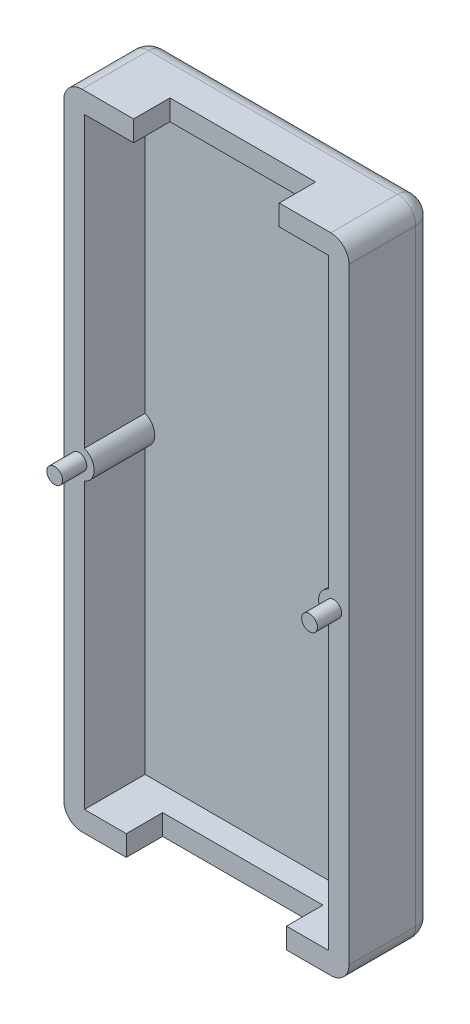
ISO-10303-21;
HEADER;
FILE_DESCRIPTION(('STEP AP214'),'2;1');
FILE_NAME('part.step','',(''),(''),'','','');
FILE_SCHEMA(('AUTOMOTIVE_DESIGN { 1 0 10303 214 1 1 1 1 }'));
ENDSEC;
DATA;
#1=APPLICATION_CONTEXT('core data for automotive mechanical design processes');
#2=APPLICATION_PROTOCOL_DEFINITION('international standard','automotive_design',2000,#1);
#3=PRODUCT_CONTEXT('',#1,'mechanical');
#4=PRODUCT('Part','Part','',(#3));
#5=PRODUCT_RELATED_PRODUCT_CATEGORY('part','',(#4));
#6=PRODUCT_DEFINITION_FORMATION('','',#4);
#7=PRODUCT_DEFINITION_CONTEXT('part definition',#1,'design');
#8=PRODUCT_DEFINITION('design','',#6,#7);
#9=PRODUCT_DEFINITION_SHAPE('','',#8);
#10=(LENGTH_UNIT() NAMED_UNIT(*) SI_UNIT(.MILLI.,.METRE.));
#11=(NAMED_UNIT(*) PLANE_ANGLE_UNIT() SI_UNIT($,.RADIAN.));
#12=(NAMED_UNIT(*) SI_UNIT($,.STERADIAN.) SOLID_ANGLE_UNIT());
#13=UNCERTAINTY_MEASURE_WITH_UNIT(LENGTH_MEASURE(1.E-05),#10,'distance_accuracy_value','');
#14=(GEOMETRIC_REPRESENTATION_CONTEXT(3) GLOBAL_UNCERTAINTY_ASSIGNED_CONTEXT((#13)) GLOBAL_UNIT_ASSIGNED_CONTEXT((#10,
#11,#12)) REPRESENTATION_CONTEXT('',''));
#15=CARTESIAN_POINT('',(0.,0.,0.));
#16=DIRECTION('',(0.,0.,1.));
#17=DIRECTION('',(1.,0.,0.));
#18=AXIS2_PLACEMENT_3D('',#15,#16,#17);
#19=CARTESIAN_POINT('',(0.,-51.3,7.));
#20=DIRECTION('',(0.,1.,0.));
#21=DIRECTION('',(0.,0.,1.));
#22=AXIS2_PLACEMENT_3D('',#19,#20,#21);
#23=PLANE('',#22);
#24=DIRECTION('',(-1.,0.,0.));
#25=VECTOR('',#24,1.);
#26=CARTESIAN_POINT('',(0.,-51.3,4.));
#27=LINE('',#26,#25);
#28=CARTESIAN_POINT('',(18.35,-51.3,4.));
#29=VERTEX_POINT('',#28);
#30=CARTESIAN_POINT('',(5.15,-51.3,4.));
#31=VERTEX_POINT('',#30);
#32=EDGE_CURVE('E233',#29,#31,#27,.T.);
#33=ORIENTED_EDGE('',*,*,#32,.F.);
#34=DIRECTION('',(0.,0.,1.));
#35=VECTOR('',#34,1.);
#36=CARTESIAN_POINT('',(18.35,-51.3,4.));
#37=LINE('',#36,#35);
#38=CARTESIAN_POINT('',(18.35,-51.3,7.));
#39=VERTEX_POINT('',#38);
#40=EDGE_CURVE('E216',#29,#39,#37,.T.);
#41=ORIENTED_EDGE('',*,*,#40,.T.);
#42=DIRECTION('',(1.,0.,0.));
#43=VECTOR('',#42,1.);
#44=CARTESIAN_POINT('',(0.,-51.3,7.));
#45=LINE('',#44,#43);
#46=CARTESIAN_POINT('',(21.8,-51.3,7.));
#47=VERTEX_POINT('',#46);
#48=EDGE_CURVE('E332',#39,#47,#45,.T.);
#49=ORIENTED_EDGE('',*,*,#48,.T.);
#50=DIRECTION('',(0.,0.,-1.));
#51=VECTOR('',#50,1.);
#52=CARTESIAN_POINT('',(21.8,-51.3,7.));
#53=LINE('',#52,#51);
#54=CARTESIAN_POINT('',(21.8,-51.3,2.));
#55=VERTEX_POINT('',#54);
#56=EDGE_CURVE('E352',#47,#55,#53,.T.);
#57=ORIENTED_EDGE('',*,*,#56,.T.);
#58=DIRECTION('',(1.,0.,0.));
#59=VECTOR('',#58,1.);
#60=CARTESIAN_POINT('',(0.,-51.3,2.));
#61=LINE('',#60,#59);
#62=CARTESIAN_POINT('',(1.70000000000001,-51.3,2.));
#63=VERTEX_POINT('',#62);
#64=EDGE_CURVE('E299',#63,#55,#61,.T.);
#65=ORIENTED_EDGE('',*,*,#64,.F.);
#66=DIRECTION('',(0.,0.,-1.));
#67=VECTOR('',#66,1.);
#68=CARTESIAN_POINT('',(1.70000000000001,-51.3,7.));
#69=LINE('',#68,#67);
#70=CARTESIAN_POINT('',(1.70000000000001,-51.3,7.));
#71=VERTEX_POINT('',#70);
#72=EDGE_CURVE('E349',#71,#63,#69,.T.);
#73=ORIENTED_EDGE('',*,*,#72,.F.);
#74=CARTESIAN_POINT('',(5.15,-51.3,7.));
#75=VERTEX_POINT('',#74);
#76=EDGE_CURVE('E333',#71,#75,#45,.T.);
#77=ORIENTED_EDGE('',*,*,#76,.T.);
#78=DIRECTION('',(0.,0.,1.));
#79=VECTOR('',#78,1.);
#80=CARTESIAN_POINT('',(5.15,-51.3,4.));
#81=LINE('',#80,#79);
#82=EDGE_CURVE('E226',#31,#75,#81,.T.);
#83=ORIENTED_EDGE('',*,*,#82,.F.);
#84=EDGE_LOOP('',(#33,#41,#49,#57,#65,#73,#77,#83));
#85=FACE_BOUND('',#84,.T.);
#86=ADVANCED_FACE('F43',(#85),#23,.T.);
#87=CARTESIAN_POINT('',(0.,-53.,7.));
#88=DIRECTION('',(0.,1.,0.));
#89=DIRECTION('',(0.,0.,1.));
#90=AXIS2_PLACEMENT_3D('',#87,#88,#89);
#91=PLANE('',#90);
#92=DIRECTION('',(1.,0.,0.));
#93=VECTOR('',#92,1.);
#94=CARTESIAN_POINT('',(0.,-53.,1.5));
#95=LINE('',#94,#93);
#96=CARTESIAN_POINT('',(1.50000000000001,-53.,1.5));
#97=VERTEX_POINT('',#96);
#98=CARTESIAN_POINT('',(22.,-53.,1.5));
#99=VERTEX_POINT('',#98);
#100=EDGE_CURVE('E379',#97,#99,#95,.T.);
#101=ORIENTED_EDGE('',*,*,#100,.T.);
#102=DIRECTION('',(0.,0.,-1.));
#103=VECTOR('',#102,1.);
#104=CARTESIAN_POINT('',(22.,-53.,7.));
#105=LINE('',#104,#103);
#106=CARTESIAN_POINT('',(22.,-53.,7.));
#107=VERTEX_POINT('',#106);
#108=EDGE_CURVE('E381',#99,#107,#105,.F.);
#109=ORIENTED_EDGE('',*,*,#108,.T.);
#110=DIRECTION('',(1.,0.,0.));
#111=VECTOR('',#110,1.);
#112=CARTESIAN_POINT('',(0.,-53.,7.));
#113=LINE('',#112,#111);
#114=CARTESIAN_POINT('',(18.35,-53.,7.));
#115=VERTEX_POINT('',#114);
#116=EDGE_CURVE('E317',#115,#107,#113,.T.);
#117=ORIENTED_EDGE('',*,*,#116,.F.);
#118=DIRECTION('',(0.,0.,1.));
#119=VECTOR('',#118,1.);
#120=CARTESIAN_POINT('',(18.35,-53.,4.));
#121=LINE('',#120,#119);
#122=CARTESIAN_POINT('',(18.35,-53.,4.));
#123=VERTEX_POINT('',#122);
#124=EDGE_CURVE('E250',#123,#115,#121,.T.);
#125=ORIENTED_EDGE('',*,*,#124,.F.);
#126=DIRECTION('',(1.,0.,0.));
#127=VECTOR('',#126,1.);
#128=CARTESIAN_POINT('',(0.,-53.,4.));
#129=LINE('',#128,#127);
#130=CARTESIAN_POINT('',(5.15,-53.,4.));
#131=VERTEX_POINT('',#130);
#132=EDGE_CURVE('E227',#131,#123,#129,.T.);
#133=ORIENTED_EDGE('',*,*,#132,.F.);
#134=DIRECTION('',(0.,0.,1.));
#135=VECTOR('',#134,1.);
#136=CARTESIAN_POINT('',(5.15,-53.,4.));
#137=LINE('',#136,#135);
#138=CARTESIAN_POINT('',(5.15,-53.,7.));
#139=VERTEX_POINT('',#138);
#140=EDGE_CURVE('E253',#131,#139,#137,.T.);
#141=ORIENTED_EDGE('',*,*,#140,.T.);
#142=CARTESIAN_POINT('',(1.50000000000001,-53.,7.));
#143=VERTEX_POINT('',#142);
#144=EDGE_CURVE('E318',#143,#139,#113,.T.);
#145=ORIENTED_EDGE('',*,*,#144,.F.);
#146=DIRECTION('',(0.,0.,-1.));
#147=VECTOR('',#146,1.);
#148=CARTESIAN_POINT('',(1.50000000000001,-53.,7.));
#149=LINE('',#148,#147);
#150=EDGE_CURVE('E377',#143,#97,#149,.T.);
#151=ORIENTED_EDGE('',*,*,#150,.T.);
#152=EDGE_LOOP('',(#101,#109,#117,#125,#133,#141,#145,#151));
#153=FACE_BOUND('',#152,.T.);
#154=ADVANCED_FACE('F501',(#153),#91,.F.);
#155=CARTESIAN_POINT('',(0.,0.,7.));
#156=DIRECTION('',(0.,1.,0.));
#157=DIRECTION('',(0.,0.,1.));
#158=AXIS2_PLACEMENT_3D('',#155,#156,#157);
#159=PLANE('',#158);
#160=DIRECTION('',(1.,0.,0.));
#161=VECTOR('',#160,1.);
#162=CARTESIAN_POINT('',(0.,0.,1.5));
#163=LINE('',#162,#161);
#164=CARTESIAN_POINT('',(22.,0.,1.5));
#165=VERTEX_POINT('',#164);
#166=CARTESIAN_POINT('',(1.5,0.,1.5));
#167=VERTEX_POINT('',#166);
#168=EDGE_CURVE('E366',#165,#167,#163,.F.);
#169=ORIENTED_EDGE('',*,*,#168,.T.);
#170=DIRECTION('',(0.,0.,-1.));
#171=VECTOR('',#170,1.);
#172=CARTESIAN_POINT('',(1.5,0.,7.));
#173=LINE('',#172,#171);
#174=CARTESIAN_POINT('',(1.5,0.,7.));
#175=VERTEX_POINT('',#174);
#176=EDGE_CURVE('E369',#167,#175,#173,.F.);
#177=ORIENTED_EDGE('',*,*,#176,.T.);
#178=DIRECTION('',(1.,0.,0.));
#179=VECTOR('',#178,1.);
#180=CARTESIAN_POINT('',(0.,0.,7.));
#181=LINE('',#180,#179);
#182=CARTESIAN_POINT('',(5.75,0.,7.));
#183=VERTEX_POINT('',#182);
#184=EDGE_CURVE('E323',#175,#183,#181,.T.);
#185=ORIENTED_EDGE('',*,*,#184,.T.);
#186=DIRECTION('',(0.,0.,1.));
#187=VECTOR('',#186,1.);
#188=CARTESIAN_POINT('',(5.75,0.,4.));
#189=LINE('',#188,#187);
#190=CARTESIAN_POINT('',(5.75,0.,4.));
#191=VERTEX_POINT('',#190);
#192=EDGE_CURVE('E279',#191,#183,#189,.T.);
#193=ORIENTED_EDGE('',*,*,#192,.F.);
#194=DIRECTION('',(-1.,0.,0.));
#195=VECTOR('',#194,1.);
#196=CARTESIAN_POINT('',(0.,0.,4.));
#197=LINE('',#196,#195);
#198=CARTESIAN_POINT('',(17.75,0.,4.));
#199=VERTEX_POINT('',#198);
#200=EDGE_CURVE('E259',#199,#191,#197,.T.);
#201=ORIENTED_EDGE('',*,*,#200,.F.);
#202=DIRECTION('',(0.,0.,1.));
#203=VECTOR('',#202,1.);
#204=CARTESIAN_POINT('',(17.75,0.,4.));
#205=LINE('',#204,#203);
#206=CARTESIAN_POINT('',(17.75,0.,7.));
#207=VERTEX_POINT('',#206);
#208=EDGE_CURVE('E269',#199,#207,#205,.T.);
#209=ORIENTED_EDGE('',*,*,#208,.T.);
#210=CARTESIAN_POINT('',(22.,0.,7.));
#211=VERTEX_POINT('',#210);
#212=EDGE_CURVE('E322',#207,#211,#181,.T.);
#213=ORIENTED_EDGE('',*,*,#212,.T.);
#214=DIRECTION('',(0.,0.,-1.));
#215=VECTOR('',#214,1.);
#216=CARTESIAN_POINT('',(22.,0.,7.));
#217=LINE('',#216,#215);
#218=EDGE_CURVE('E364',#211,#165,#217,.T.);
#219=ORIENTED_EDGE('',*,*,#218,.T.);
#220=EDGE_LOOP('',(#169,#177,#185,#193,#201,#209,#213,#219));
#221=FACE_BOUND('',#220,.T.);
#222=ADVANCED_FACE('F461',(#221),#159,.T.);
#223=CARTESIAN_POINT('',(0.,-1.7,7.));
#224=DIRECTION('',(0.,1.,0.));
#225=DIRECTION('',(0.,0.,1.));
#226=AXIS2_PLACEMENT_3D('',#223,#224,#225);
#227=PLANE('',#226);
#228=DIRECTION('',(0.,0.,1.));
#229=VECTOR('',#228,1.);
#230=CARTESIAN_POINT('',(17.75,-1.7,4.));
#231=LINE('',#230,#229);
#232=CARTESIAN_POINT('',(17.75,-1.7,4.));
#233=VERTEX_POINT('',#232);
#234=CARTESIAN_POINT('',(17.75,-1.7,7.));
#235=VERTEX_POINT('',#234);
#236=EDGE_CURVE('E247',#233,#235,#231,.T.);
#237=ORIENTED_EDGE('',*,*,#236,.F.);
#238=DIRECTION('',(1.,0.,0.));
#239=VECTOR('',#238,1.);
#240=CARTESIAN_POINT('',(0.,-1.7,4.));
#241=LINE('',#240,#239);
#242=CARTESIAN_POINT('',(5.75,-1.7,4.));
#243=VERTEX_POINT('',#242);
#244=EDGE_CURVE('E266',#243,#233,#241,.T.);
#245=ORIENTED_EDGE('',*,*,#244,.F.);
#246=DIRECTION('',(0.,0.,1.));
#247=VECTOR('',#246,1.);
#248=CARTESIAN_POINT('',(5.75,-1.7,4.));
#249=LINE('',#248,#247);
#250=CARTESIAN_POINT('',(5.75,-1.7,7.));
#251=VERTEX_POINT('',#250);
#252=EDGE_CURVE('E276',#243,#251,#249,.T.);
#253=ORIENTED_EDGE('',*,*,#252,.T.);
#254=DIRECTION('',(1.,0.,0.));
#255=VECTOR('',#254,1.);
#256=CARTESIAN_POINT('',(0.,-1.7,7.));
#257=LINE('',#256,#255);
#258=CARTESIAN_POINT('',(1.7,-1.7,7.));
#259=VERTEX_POINT('',#258);
#260=EDGE_CURVE('E340',#259,#251,#257,.T.);
#261=ORIENTED_EDGE('',*,*,#260,.F.);
#262=DIRECTION('',(0.,0.,-1.));
#263=VECTOR('',#262,1.);
#264=CARTESIAN_POINT('',(1.7,-1.7,7.));
#265=LINE('',#264,#263);
#266=CARTESIAN_POINT('',(1.7,-1.7,2.));
#267=VERTEX_POINT('',#266);
#268=EDGE_CURVE('E346',#259,#267,#265,.T.);
#269=ORIENTED_EDGE('',*,*,#268,.T.);
#270=DIRECTION('',(1.,0.,0.));
#271=VECTOR('',#270,1.);
#272=CARTESIAN_POINT('',(0.,-1.7,2.));
#273=LINE('',#272,#271);
#274=CARTESIAN_POINT('',(21.8,-1.7,2.));
#275=VERTEX_POINT('',#274);
#276=EDGE_CURVE('E289',#267,#275,#273,.T.);
#277=ORIENTED_EDGE('',*,*,#276,.T.);
#278=DIRECTION('',(0.,0.,-1.));
#279=VECTOR('',#278,1.);
#280=CARTESIAN_POINT('',(21.8,-1.7,7.));
#281=LINE('',#280,#279);
#282=CARTESIAN_POINT('',(21.8,-1.7,7.));
#283=VERTEX_POINT('',#282);
#284=EDGE_CURVE('E343',#283,#275,#281,.T.);
#285=ORIENTED_EDGE('',*,*,#284,.F.);
#286=EDGE_CURVE('E339',#235,#283,#257,.T.);
#287=ORIENTED_EDGE('',*,*,#286,.F.);
#288=EDGE_LOOP('',(#237,#245,#253,#261,#269,#277,#285,#287));
#289=FACE_BOUND('',#288,.T.);
#290=ADVANCED_FACE('F446',(#289),#227,.F.);
#291=CARTESIAN_POINT('',(0.,0.,7.));
#292=DIRECTION('',(0.,0.,1.));
#293=DIRECTION('',(1.,0.,0.));
#294=AXIS2_PLACEMENT_3D('',#291,#292,#293);
#295=PLANE('',#294);
#296=CARTESIAN_POINT('',(22.25,-26.7,7.));
#297=DIRECTION('',(0.,0.,1.));
#298=DIRECTION('',(1.,0.,0.));
#299=AXIS2_PLACEMENT_3D('',#296,#297,#298);
#300=CIRCLE('',#299,0.650000000000001);
#301=CARTESIAN_POINT('',(22.9,-26.7,7.));
#302=VERTEX_POINT('',#301);
#303=EDGE_CURVE('E433',#302,#302,#300,.T.);
#304=ORIENTED_EDGE('',*,*,#303,.F.);
#305=EDGE_LOOP('',(#304));
#306=FACE_BOUND('',#305,.T.);
#307=DIRECTION('',(0.,-1.,0.));
#308=VECTOR('',#307,1.);
#309=CARTESIAN_POINT('',(23.5,0.,7.));
#310=LINE('',#309,#308);
#311=CARTESIAN_POINT('',(23.5,-1.5,7.));
#312=VERTEX_POINT('',#311);
#313=CARTESIAN_POINT('',(23.5,-51.5,7.));
#314=VERTEX_POINT('',#313);
#315=EDGE_CURVE('E320',#312,#314,#310,.T.);
#316=ORIENTED_EDGE('',*,*,#315,.F.);
#317=CARTESIAN_POINT('',(22.,-1.5,7.));
#318=DIRECTION('',(0.,0.,1.));
#319=DIRECTION('',(1.,0.,0.));
#320=AXIS2_PLACEMENT_3D('',#317,#318,#319);
#321=CIRCLE('',#320,1.5);
#322=EDGE_CURVE('E11',#312,#211,#321,.T.);
#323=ORIENTED_EDGE('',*,*,#322,.T.);
#324=ORIENTED_EDGE('',*,*,#212,.F.);
#325=DIRECTION('',(0.,-1.,0.));
#326=VECTOR('',#325,1.);
#327=CARTESIAN_POINT('',(17.75,0.,7.));
#328=LINE('',#327,#326);
#329=EDGE_CURVE('E270',#207,#235,#328,.T.);
#330=ORIENTED_EDGE('',*,*,#329,.T.);
#331=ORIENTED_EDGE('',*,*,#286,.T.);
#332=DIRECTION('',(0.,-1.,0.));
#333=VECTOR('',#332,1.);
#334=CARTESIAN_POINT('',(21.8,0.,7.));
#335=LINE('',#334,#333);
#336=CARTESIAN_POINT('',(21.8,-25.5338096210309,7.));
#337=VERTEX_POINT('',#336);
#338=EDGE_CURVE('E329',#283,#337,#335,.T.);
#339=ORIENTED_EDGE('',*,*,#338,.T.);
#340=CARTESIAN_POINT('',(22.25,-26.7,7.));
#341=DIRECTION('',(0.,0.,1.));
#342=DIRECTION('',(1.,0.,0.));
#343=AXIS2_PLACEMENT_3D('',#340,#341,#342);
#344=CIRCLE('',#343,1.25);
#345=CARTESIAN_POINT('',(21.8,-27.8661903789691,7.));
#346=VERTEX_POINT('',#345);
#347=EDGE_CURVE('E301',#337,#346,#344,.T.);
#348=ORIENTED_EDGE('',*,*,#347,.T.);
#349=EDGE_CURVE('E328',#346,#47,#335,.T.);
#350=ORIENTED_EDGE('',*,*,#349,.T.);
#351=ORIENTED_EDGE('',*,*,#48,.F.);
#352=DIRECTION('',(0.,-1.,0.));
#353=VECTOR('',#352,1.);
#354=CARTESIAN_POINT('',(18.3499999999999,0.,7.));
#355=LINE('',#354,#353);
#356=EDGE_CURVE('E222',#39,#115,#355,.T.);
#357=ORIENTED_EDGE('',*,*,#356,.T.);
#358=ORIENTED_EDGE('',*,*,#116,.T.);
#359=CARTESIAN_POINT('',(22.,-51.5,7.));
#360=DIRECTION('',(0.,0.,1.));
#361=DIRECTION('',(1.,0.,0.));
#362=AXIS2_PLACEMENT_3D('',#359,#360,#361);
#363=CIRCLE('',#362,1.5);
#364=EDGE_CURVE('E52',#107,#314,#363,.T.);
#365=ORIENTED_EDGE('',*,*,#364,.T.);
#366=EDGE_LOOP('',(#316,#323,#324,#330,#331,#339,#348,#350,#351,#357,#358,#365));
#367=FACE_BOUND('',#366,.T.);
#368=ADVANCED_FACE('F442',(#306,#367),#295,.T.);
#369=CARTESIAN_POINT('',(1.25,-26.7,7.));
#370=DIRECTION('',(0.,0.,1.));
#371=DIRECTION('',(1.,0.,0.));
#372=AXIS2_PLACEMENT_3D('',#369,#370,#371);
#373=CIRCLE('',#372,0.65);
#374=CARTESIAN_POINT('',(1.9,-26.7,7.));
#375=VERTEX_POINT('',#374);
#376=EDGE_CURVE('E428',#375,#375,#373,.T.);
#377=ORIENTED_EDGE('',*,*,#376,.F.);
#378=EDGE_LOOP('',(#377));
#379=FACE_BOUND('',#378,.T.);
#380=ORIENTED_EDGE('',*,*,#184,.F.);
#381=CARTESIAN_POINT('',(1.5,-1.5,7.));
#382=DIRECTION('',(0.,0.,1.));
#383=DIRECTION('',(1.,0.,0.));
#384=AXIS2_PLACEMENT_3D('',#381,#382,#383);
#385=CIRCLE('',#384,1.5);
#386=CARTESIAN_POINT('',(0.,-1.5,7.));
#387=VERTEX_POINT('',#386);
#388=EDGE_CURVE('E389',#175,#387,#385,.T.);
#389=ORIENTED_EDGE('',*,*,#388,.T.);
#390=DIRECTION('',(0.,-1.,0.));
#391=VECTOR('',#390,1.);
#392=CARTESIAN_POINT('',(0.,0.,7.));
#393=LINE('',#392,#391);
#394=CARTESIAN_POINT('',(0.,-51.5,7.));
#395=VERTEX_POINT('',#394);
#396=EDGE_CURVE('E325',#387,#395,#393,.T.);
#397=ORIENTED_EDGE('',*,*,#396,.T.);
#398=CARTESIAN_POINT('',(1.50000000000001,-51.5,7.));
#399=DIRECTION('',(0.,0.,1.));
#400=DIRECTION('',(1.,0.,0.));
#401=AXIS2_PLACEMENT_3D('',#398,#399,#400);
#402=CIRCLE('',#401,1.5);
#403=EDGE_CURVE('E387',#395,#143,#402,.T.);
#404=ORIENTED_EDGE('',*,*,#403,.T.);
#405=ORIENTED_EDGE('',*,*,#144,.T.);
#406=DIRECTION('',(0.,-1.,0.));
#407=VECTOR('',#406,1.);
#408=CARTESIAN_POINT('',(5.15,0.,7.));
#409=LINE('',#408,#407);
#410=EDGE_CURVE('E237',#75,#139,#409,.T.);
#411=ORIENTED_EDGE('',*,*,#410,.F.);
#412=ORIENTED_EDGE('',*,*,#76,.F.);
#413=DIRECTION('',(0.,-1.,0.));
#414=VECTOR('',#413,1.);
#415=CARTESIAN_POINT('',(1.7,0.,7.));
#416=LINE('',#415,#414);
#417=CARTESIAN_POINT('',(1.7,-27.8661903789691,7.));
#418=VERTEX_POINT('',#417);
#419=EDGE_CURVE('E335',#418,#71,#416,.T.);
#420=ORIENTED_EDGE('',*,*,#419,.F.);
#421=CARTESIAN_POINT('',(1.25,-26.7,7.));
#422=DIRECTION('',(0.,0.,1.));
#423=DIRECTION('',(1.,0.,0.));
#424=AXIS2_PLACEMENT_3D('',#421,#422,#423);
#425=CIRCLE('',#424,1.25);
#426=CARTESIAN_POINT('',(1.7,-25.5338096210309,7.));
#427=VERTEX_POINT('',#426);
#428=EDGE_CURVE('E309',#418,#427,#425,.T.);
#429=ORIENTED_EDGE('',*,*,#428,.T.);
#430=EDGE_CURVE('E336',#259,#427,#416,.T.);
#431=ORIENTED_EDGE('',*,*,#430,.F.);
#432=ORIENTED_EDGE('',*,*,#260,.T.);
#433=DIRECTION('',(0.,-1.,0.));
#434=VECTOR('',#433,1.);
#435=CARTESIAN_POINT('',(5.75,0.,7.));
#436=LINE('',#435,#434);
#437=EDGE_CURVE('E260',#183,#251,#436,.T.);
#438=ORIENTED_EDGE('',*,*,#437,.F.);
#439=EDGE_LOOP('',(#380,#389,#397,#404,#405,#411,#412,#420,#429,#431,#432,#438));
#440=FACE_BOUND('',#439,.T.);
#441=ADVANCED_FACE('F445',(#379,#440),#295,.T.);
#442=CARTESIAN_POINT('',(21.8,0.,7.));
#443=DIRECTION('',(1.,0.,0.));
#444=DIRECTION('',(0.,1.,0.));
#445=AXIS2_PLACEMENT_3D('',#442,#443,#444);
#446=PLANE('',#445);
#447=DIRECTION('',(0.,0.,-1.));
#448=VECTOR('',#447,1.);
#449=CARTESIAN_POINT('',(21.8,-27.8661903789691,7.));
#450=LINE('',#449,#448);
#451=CARTESIAN_POINT('',(21.8,-27.8661903789691,2.));
#452=VERTEX_POINT('',#451);
#453=EDGE_CURVE('E307',#452,#346,#450,.F.);
#454=ORIENTED_EDGE('',*,*,#453,.F.);
#455=DIRECTION('',(0.,-1.,0.));
#456=VECTOR('',#455,1.);
#457=CARTESIAN_POINT('',(21.8,0.,2.));
#458=LINE('',#457,#456);
#459=EDGE_CURVE('E290',#452,#55,#458,.T.);
#460=ORIENTED_EDGE('',*,*,#459,.T.);
#461=ORIENTED_EDGE('',*,*,#56,.F.);
#462=ORIENTED_EDGE('',*,*,#349,.F.);
#463=EDGE_LOOP('',(#454,#460,#461,#462));
#464=FACE_BOUND('',#463,.T.);
#465=ADVANCED_FACE('F481',(#464),#446,.F.);
#466=ORIENTED_EDGE('',*,*,#284,.T.);
#467=CARTESIAN_POINT('',(21.8,-25.5338096210309,2.));
#468=VERTEX_POINT('',#467);
#469=EDGE_CURVE('E286',#275,#468,#458,.T.);
#470=ORIENTED_EDGE('',*,*,#469,.T.);
#471=DIRECTION('',(0.,0.,-1.));
#472=VECTOR('',#471,1.);
#473=CARTESIAN_POINT('',(21.8,-25.5338096210309,7.));
#474=LINE('',#473,#472);
#475=EDGE_CURVE('E304',#337,#468,#474,.T.);
#476=ORIENTED_EDGE('',*,*,#475,.F.);
#477=ORIENTED_EDGE('',*,*,#338,.F.);
#478=EDGE_LOOP('',(#466,#470,#476,#477));
#479=FACE_BOUND('',#478,.T.);
#480=ADVANCED_FACE('F471',(#479),#446,.F.);
#481=CARTESIAN_POINT('',(1.7,0.,7.));
#482=DIRECTION('',(1.,0.,0.));
#483=DIRECTION('',(0.,1.,0.));
#484=AXIS2_PLACEMENT_3D('',#481,#482,#483);
#485=PLANE('',#484);
#486=DIRECTION('',(0.,-1.,0.));
#487=VECTOR('',#486,1.);
#488=CARTESIAN_POINT('',(1.7,0.,2.));
#489=LINE('',#488,#487);
#490=CARTESIAN_POINT('',(1.7,-27.8661903789691,2.));
#491=VERTEX_POINT('',#490);
#492=EDGE_CURVE('E296',#491,#63,#489,.T.);
#493=ORIENTED_EDGE('',*,*,#492,.F.);
#494=DIRECTION('',(0.,0.,-1.));
#495=VECTOR('',#494,1.);
#496=CARTESIAN_POINT('',(1.7,-27.8661903789691,7.));
#497=LINE('',#496,#495);
#498=EDGE_CURVE('E315',#491,#418,#497,.F.);
#499=ORIENTED_EDGE('',*,*,#498,.T.);
#500=ORIENTED_EDGE('',*,*,#419,.T.);
#501=ORIENTED_EDGE('',*,*,#72,.T.);
#502=EDGE_LOOP('',(#493,#499,#500,#501));
#503=FACE_BOUND('',#502,.T.);
#504=ADVANCED_FACE('F489',(#503),#485,.T.);
#505=CARTESIAN_POINT('',(1.7,-25.5338096210309,2.));
#506=VERTEX_POINT('',#505);
#507=EDGE_CURVE('E293',#267,#506,#489,.T.);
#508=ORIENTED_EDGE('',*,*,#507,.F.);
#509=ORIENTED_EDGE('',*,*,#268,.F.);
#510=ORIENTED_EDGE('',*,*,#430,.T.);
#511=DIRECTION('',(0.,0.,-1.));
#512=VECTOR('',#511,1.);
#513=CARTESIAN_POINT('',(1.7,-25.5338096210309,7.));
#514=LINE('',#513,#512);
#515=EDGE_CURVE('E312',#427,#506,#514,.T.);
#516=ORIENTED_EDGE('',*,*,#515,.T.);
#517=EDGE_LOOP('',(#508,#509,#510,#516));
#518=FACE_BOUND('',#517,.T.);
#519=ADVANCED_FACE('F569',(#518),#485,.T.);
#520=CARTESIAN_POINT('',(23.5,0.,7.));
#521=DIRECTION('',(1.,0.,0.));
#522=DIRECTION('',(0.,1.,0.));
#523=AXIS2_PLACEMENT_3D('',#520,#521,#522);
#524=PLANE('',#523);
#525=DIRECTION('',(0.,-1.,0.));
#526=VECTOR('',#525,1.);
#527=CARTESIAN_POINT('',(23.5,0.,1.5));
#528=LINE('',#527,#526);
#529=CARTESIAN_POINT('',(23.5,-51.5,1.5));
#530=VERTEX_POINT('',#529);
#531=CARTESIAN_POINT('',(23.5,-1.5,1.5));
#532=VERTEX_POINT('',#531);
#533=EDGE_CURVE('E60',#530,#532,#528,.F.);
#534=ORIENTED_EDGE('',*,*,#533,.T.);
#535=DIRECTION('',(0.,0.,-1.));
#536=VECTOR('',#535,1.);
#537=CARTESIAN_POINT('',(23.5,-1.5,7.));
#538=LINE('',#537,#536);
#539=EDGE_CURVE('E385',#532,#312,#538,.F.);
#540=ORIENTED_EDGE('',*,*,#539,.T.);
#541=ORIENTED_EDGE('',*,*,#315,.T.);
#542=DIRECTION('',(0.,0.,-1.));
#543=VECTOR('',#542,1.);
#544=CARTESIAN_POINT('',(23.5,-51.5,0.));
#545=LINE('',#544,#543);
#546=EDGE_CURVE('E65',#314,#530,#545,.T.);
#547=ORIENTED_EDGE('',*,*,#546,.T.);
#548=EDGE_LOOP('',(#534,#540,#541,#547));
#549=FACE_BOUND('',#548,.T.);
#550=ADVANCED_FACE('F564',(#549),#524,.T.);
#551=CARTESIAN_POINT('',(0.,0.,7.));
#552=DIRECTION('',(1.,0.,0.));
#553=DIRECTION('',(0.,1.,0.));
#554=AXIS2_PLACEMENT_3D('',#551,#552,#553);
#555=PLANE('',#554);
#556=ORIENTED_EDGE('',*,*,#396,.F.);
#557=DIRECTION('',(0.,0.,-1.));
#558=VECTOR('',#557,1.);
#559=CARTESIAN_POINT('',(0.,-1.5,0.));
#560=LINE('',#559,#558);
#561=CARTESIAN_POINT('',(0.,-1.5,1.5));
#562=VERTEX_POINT('',#561);
#563=EDGE_CURVE('E375',#387,#562,#560,.T.);
#564=ORIENTED_EDGE('',*,*,#563,.T.);
#565=DIRECTION('',(0.,-1.,0.));
#566=VECTOR('',#565,1.);
#567=CARTESIAN_POINT('',(0.,0.,1.5));
#568=LINE('',#567,#566);
#569=CARTESIAN_POINT('',(0.,-51.5,1.5));
#570=VERTEX_POINT('',#569);
#571=EDGE_CURVE('E373',#562,#570,#568,.T.);
#572=ORIENTED_EDGE('',*,*,#571,.T.);
#573=DIRECTION('',(0.,0.,-1.));
#574=VECTOR('',#573,1.);
#575=CARTESIAN_POINT('',(0.,-51.5,7.));
#576=LINE('',#575,#574);
#577=EDGE_CURVE('E371',#570,#395,#576,.F.);
#578=ORIENTED_EDGE('',*,*,#577,.T.);
#579=EDGE_LOOP('',(#556,#564,#572,#578));
#580=FACE_BOUND('',#579,.T.);
#581=ADVANCED_FACE('F560',(#580),#555,.F.);
#582=CARTESIAN_POINT('',(0.,0.,0.));
#583=DIRECTION('',(0.,0.,1.));
#584=DIRECTION('',(1.,0.,0.));
#585=AXIS2_PLACEMENT_3D('',#582,#583,#584);
#586=PLANE('',#585);
#587=DIRECTION('',(0.,-1.,0.));
#588=VECTOR('',#587,1.);
#589=CARTESIAN_POINT('',(1.5,0.,0.));
#590=LINE('',#589,#588);
#591=CARTESIAN_POINT('',(1.50000000000001,-51.5,0.));
#592=VERTEX_POINT('',#591);
#593=CARTESIAN_POINT('',(1.5,-1.5,0.));
#594=VERTEX_POINT('',#593);
#595=EDGE_CURVE('E359',#592,#594,#590,.F.);
#596=ORIENTED_EDGE('',*,*,#595,.T.);
#597=DIRECTION('',(1.,0.,0.));
#598=VECTOR('',#597,1.);
#599=CARTESIAN_POINT('',(23.5,-1.5,0.));
#600=LINE('',#599,#598);
#601=CARTESIAN_POINT('',(22.,-1.5,0.));
#602=VERTEX_POINT('',#601);
#603=EDGE_CURVE('E361',#594,#602,#600,.T.);
#604=ORIENTED_EDGE('',*,*,#603,.T.);
#605=DIRECTION('',(0.,-1.,0.));
#606=VECTOR('',#605,1.);
#607=CARTESIAN_POINT('',(22.,-53.,0.));
#608=LINE('',#607,#606);
#609=CARTESIAN_POINT('',(22.,-51.5,0.));
#610=VERTEX_POINT('',#609);
#611=EDGE_CURVE('E355',#602,#610,#608,.T.);
#612=ORIENTED_EDGE('',*,*,#611,.T.);
#613=DIRECTION('',(1.,0.,0.));
#614=VECTOR('',#613,1.);
#615=CARTESIAN_POINT('',(0.,-51.5,0.));
#616=LINE('',#615,#614);
#617=EDGE_CURVE('E357',#610,#592,#616,.F.);
#618=ORIENTED_EDGE('',*,*,#617,.T.);
#619=EDGE_LOOP('',(#596,#604,#612,#618));
#620=FACE_BOUND('',#619,.T.);
#621=ADVANCED_FACE('F563',(#620),#586,.F.);
#622=CARTESIAN_POINT('',(1.25,-26.7,7.));
#623=DIRECTION('',(0.,0.,-1.));
#624=DIRECTION('',(-1.,0.,0.));
#625=AXIS2_PLACEMENT_3D('',#622,#623,#624);
#626=CYLINDRICAL_SURFACE('',#625,1.25);
#627=ORIENTED_EDGE('',*,*,#498,.F.);
#628=CARTESIAN_POINT('',(1.25,-26.7,2.));
#629=DIRECTION('',(0.,0.,1.));
#630=DIRECTION('',(1.,0.,0.));
#631=AXIS2_PLACEMENT_3D('',#628,#629,#630);
#632=CIRCLE('',#631,1.25);
#633=EDGE_CURVE('E295',#491,#506,#632,.T.);
#634=ORIENTED_EDGE('',*,*,#633,.T.);
#635=ORIENTED_EDGE('',*,*,#515,.F.);
#636=ORIENTED_EDGE('',*,*,#428,.F.);
#637=EDGE_LOOP('',(#627,#634,#635,#636));
#638=FACE_BOUND('',#637,.T.);
#639=ADVANCED_FACE('F609',(#638),#626,.T.);
#640=CARTESIAN_POINT('',(22.25,-26.7,7.));
#641=DIRECTION('',(0.,0.,-1.));
#642=DIRECTION('',(-1.,0.,0.));
#643=AXIS2_PLACEMENT_3D('',#640,#641,#642);
#644=CYLINDRICAL_SURFACE('',#643,1.25);
#645=ORIENTED_EDGE('',*,*,#475,.T.);
#646=CARTESIAN_POINT('',(22.25,-26.7,2.));
#647=DIRECTION('',(0.,0.,1.));
#648=DIRECTION('',(1.,0.,0.));
#649=AXIS2_PLACEMENT_3D('',#646,#647,#648);
#650=CIRCLE('',#649,1.25);
#651=EDGE_CURVE('E252',#468,#452,#650,.T.);
#652=ORIENTED_EDGE('',*,*,#651,.T.);
#653=ORIENTED_EDGE('',*,*,#453,.T.);
#654=ORIENTED_EDGE('',*,*,#347,.F.);
#655=EDGE_LOOP('',(#645,#652,#653,#654));
#656=FACE_BOUND('',#655,.T.);
#657=ADVANCED_FACE('F475',(#656),#644,.T.);
#658=CARTESIAN_POINT('',(0.,0.,2.));
#659=DIRECTION('',(0.,0.,1.));
#660=DIRECTION('',(1.,0.,0.));
#661=AXIS2_PLACEMENT_3D('',#658,#659,#660);
#662=PLANE('',#661);
#663=ORIENTED_EDGE('',*,*,#651,.F.);
#664=ORIENTED_EDGE('',*,*,#469,.F.);
#665=ORIENTED_EDGE('',*,*,#276,.F.);
#666=ORIENTED_EDGE('',*,*,#507,.T.);
#667=ORIENTED_EDGE('',*,*,#633,.F.);
#668=ORIENTED_EDGE('',*,*,#492,.T.);
#669=ORIENTED_EDGE('',*,*,#64,.T.);
#670=ORIENTED_EDGE('',*,*,#459,.F.);
#671=EDGE_LOOP('',(#663,#664,#665,#666,#667,#668,#669,#670));
#672=FACE_BOUND('',#671,.T.);
#673=ADVANCED_FACE('F540',(#672),#662,.T.);
#674=CARTESIAN_POINT('',(17.75,0.,4.));
#675=DIRECTION('',(-1.,0.,0.));
#676=DIRECTION('',(0.,0.,1.));
#677=AXIS2_PLACEMENT_3D('',#674,#675,#676);
#678=PLANE('',#677);
#679=ORIENTED_EDGE('',*,*,#329,.F.);
#680=ORIENTED_EDGE('',*,*,#208,.F.);
#681=DIRECTION('',(0.,-1.,0.));
#682=VECTOR('',#681,1.);
#683=CARTESIAN_POINT('',(17.75,0.,4.));
#684=LINE('',#683,#682);
#685=EDGE_CURVE('E257',#199,#233,#684,.T.);
#686=ORIENTED_EDGE('',*,*,#685,.T.);
#687=ORIENTED_EDGE('',*,*,#236,.T.);
#688=EDGE_LOOP('',(#679,#680,#686,#687));
#689=FACE_BOUND('',#688,.T.);
#690=ADVANCED_FACE('F538',(#689),#678,.T.);
#691=CARTESIAN_POINT('',(5.75,0.,4.));
#692=DIRECTION('',(-1.,0.,0.));
#693=DIRECTION('',(0.,0.,1.));
#694=AXIS2_PLACEMENT_3D('',#691,#692,#693);
#695=PLANE('',#694);
#696=ORIENTED_EDGE('',*,*,#437,.T.);
#697=ORIENTED_EDGE('',*,*,#252,.F.);
#698=DIRECTION('',(0.,-1.,0.));
#699=VECTOR('',#698,1.);
#700=CARTESIAN_POINT('',(5.75,0.,4.));
#701=LINE('',#700,#699);
#702=EDGE_CURVE('E263',#191,#243,#701,.T.);
#703=ORIENTED_EDGE('',*,*,#702,.F.);
#704=ORIENTED_EDGE('',*,*,#192,.T.);
#705=EDGE_LOOP('',(#696,#697,#703,#704));
#706=FACE_BOUND('',#705,.T.);
#707=ADVANCED_FACE('F534',(#706),#695,.F.);
#708=CARTESIAN_POINT('',(0.,0.,4.));
#709=DIRECTION('',(0.,0.,1.));
#710=DIRECTION('',(1.,0.,0.));
#711=AXIS2_PLACEMENT_3D('',#708,#709,#710);
#712=PLANE('',#711);
#713=ORIENTED_EDGE('',*,*,#685,.F.);
#714=ORIENTED_EDGE('',*,*,#200,.T.);
#715=ORIENTED_EDGE('',*,*,#702,.T.);
#716=ORIENTED_EDGE('',*,*,#244,.T.);
#717=EDGE_LOOP('',(#713,#714,#715,#716));
#718=FACE_BOUND('',#717,.T.);
#719=ADVANCED_FACE('F537',(#718),#712,.T.);
#720=CARTESIAN_POINT('',(18.3499999999999,0.,4.));
#721=DIRECTION('',(-1.,0.,0.));
#722=DIRECTION('',(0.,-1.,0.));
#723=AXIS2_PLACEMENT_3D('',#720,#721,#722);
#724=PLANE('',#723);
#725=ORIENTED_EDGE('',*,*,#356,.F.);
#726=ORIENTED_EDGE('',*,*,#40,.F.);
#727=DIRECTION('',(0.,-1.,0.));
#728=VECTOR('',#727,1.);
#729=CARTESIAN_POINT('',(18.3499999999999,0.,4.));
#730=LINE('',#729,#728);
#731=EDGE_CURVE('E219',#29,#123,#730,.T.);
#732=ORIENTED_EDGE('',*,*,#731,.T.);
#733=ORIENTED_EDGE('',*,*,#124,.T.);
#734=EDGE_LOOP('',(#725,#726,#732,#733));
#735=FACE_BOUND('',#734,.T.);
#736=ADVANCED_FACE('F218',(#735),#724,.T.);
#737=CARTESIAN_POINT('',(5.15,0.,4.));
#738=DIRECTION('',(-1.,0.,0.));
#739=DIRECTION('',(0.,0.,1.));
#740=AXIS2_PLACEMENT_3D('',#737,#738,#739);
#741=PLANE('',#740);
#742=ORIENTED_EDGE('',*,*,#410,.T.);
#743=ORIENTED_EDGE('',*,*,#140,.F.);
#744=DIRECTION('',(0.,-1.,0.));
#745=VECTOR('',#744,1.);
#746=CARTESIAN_POINT('',(5.15,0.,4.));
#747=LINE('',#746,#745);
#748=EDGE_CURVE('E240',#31,#131,#747,.T.);
#749=ORIENTED_EDGE('',*,*,#748,.F.);
#750=ORIENTED_EDGE('',*,*,#82,.T.);
#751=EDGE_LOOP('',(#742,#743,#749,#750));
#752=FACE_BOUND('',#751,.T.);
#753=ADVANCED_FACE('F499',(#752),#741,.F.);
#754=CARTESIAN_POINT('',(0.,0.,4.));
#755=DIRECTION('',(0.,0.,1.));
#756=DIRECTION('',(1.,0.,0.));
#757=AXIS2_PLACEMENT_3D('',#754,#755,#756);
#758=PLANE('',#757);
#759=ORIENTED_EDGE('',*,*,#731,.F.);
#760=ORIENTED_EDGE('',*,*,#32,.T.);
#761=ORIENTED_EDGE('',*,*,#748,.T.);
#762=ORIENTED_EDGE('',*,*,#132,.T.);
#763=EDGE_LOOP('',(#759,#760,#761,#762));
#764=FACE_BOUND('',#763,.T.);
#765=ADVANCED_FACE('F231',(#764),#758,.T.);
#766=CARTESIAN_POINT('',(22.25,-26.7,9.));
#767=DIRECTION('',(0.,0.,-1.));
#768=DIRECTION('',(-1.,0.,0.));
#769=AXIS2_PLACEMENT_3D('',#766,#767,#768);
#770=CYLINDRICAL_SURFACE('',#769,0.650000000000001);
#771=CARTESIAN_POINT('',(22.25,-26.7,9.));
#772=DIRECTION('',(0.,0.,1.));
#773=DIRECTION('',(1.,0.,0.));
#774=AXIS2_PLACEMENT_3D('',#771,#772,#773);
#775=CIRCLE('',#774,0.650000000000001);
#776=CARTESIAN_POINT('',(22.9,-26.7,9.));
#777=VERTEX_POINT('',#776);
#778=EDGE_CURVE('E273',#777,#777,#775,.T.);
#779=ORIENTED_EDGE('',*,*,#778,.F.);
#780=EDGE_LOOP('',(#779));
#781=FACE_BOUND('',#780,.T.);
#782=ORIENTED_EDGE('',*,*,#303,.T.);
#783=EDGE_LOOP('',(#782));
#784=FACE_BOUND('',#783,.T.);
#785=ADVANCED_FACE('F440',(#781,#784),#770,.T.);
#786=CARTESIAN_POINT('',(0.,0.,9.));
#787=DIRECTION('',(0.,0.,1.));
#788=DIRECTION('',(1.,0.,0.));
#789=AXIS2_PLACEMENT_3D('',#786,#787,#788);
#790=PLANE('',#789);
#791=ORIENTED_EDGE('',*,*,#778,.T.);
#792=EDGE_LOOP('',(#791));
#793=FACE_BOUND('',#792,.T.);
#794=ADVANCED_FACE('F685',(#793),#790,.T.);
#795=CARTESIAN_POINT('',(1.25,-26.7,9.));
#796=DIRECTION('',(0.,0.,-1.));
#797=DIRECTION('',(-1.,0.,0.));
#798=AXIS2_PLACEMENT_3D('',#795,#796,#797);
#799=CYLINDRICAL_SURFACE('',#798,0.65);
#800=CARTESIAN_POINT('',(1.25,-26.7,9.));
#801=DIRECTION('',(0.,0.,1.));
#802=DIRECTION('',(1.,0.,0.));
#803=AXIS2_PLACEMENT_3D('',#800,#801,#802);
#804=CIRCLE('',#803,0.65);
#805=CARTESIAN_POINT('',(1.9,-26.7,9.));
#806=VERTEX_POINT('',#805);
#807=EDGE_CURVE('E425',#806,#806,#804,.T.);
#808=ORIENTED_EDGE('',*,*,#807,.F.);
#809=EDGE_LOOP('',(#808));
#810=FACE_BOUND('',#809,.T.);
#811=ORIENTED_EDGE('',*,*,#376,.T.);
#812=EDGE_LOOP('',(#811));
#813=FACE_BOUND('',#812,.T.);
#814=ADVANCED_FACE('F694',(#810,#813),#799,.T.);
#815=CARTESIAN_POINT('',(1.25,-26.7,9.));
#816=DIRECTION('',(0.,0.,1.));
#817=DIRECTION('',(1.,0.,0.));
#818=AXIS2_PLACEMENT_3D('',#815,#816,#817);
#819=PLANE('',#818);
#820=ORIENTED_EDGE('',*,*,#807,.T.);
#821=EDGE_LOOP('',(#820));
#822=FACE_BOUND('',#821,.T.);
#823=ADVANCED_FACE('F599',(#822),#819,.T.);
#824=CARTESIAN_POINT('',(1.50000000000001,-51.5,7.));
#825=DIRECTION('',(0.,0.,-1.));
#826=DIRECTION('',(-1.,0.,0.));
#827=AXIS2_PLACEMENT_3D('',#824,#825,#826);
#828=CYLINDRICAL_SURFACE('',#827,1.5);
#829=ORIENTED_EDGE('',*,*,#403,.F.);
#830=ORIENTED_EDGE('',*,*,#577,.F.);
#831=CARTESIAN_POINT('',(1.50000000000001,-51.5,1.5));
#832=DIRECTION('',(0.,0.,-1.));
#833=DIRECTION('',(-1.,0.,0.));
#834=AXIS2_PLACEMENT_3D('',#831,#832,#833);
#835=CIRCLE('',#834,1.5);
#836=EDGE_CURVE('E47',#97,#570,#835,.T.);
#837=ORIENTED_EDGE('',*,*,#836,.F.);
#838=ORIENTED_EDGE('',*,*,#150,.F.);
#839=EDGE_LOOP('',(#829,#830,#837,#838));
#840=FACE_BOUND('',#839,.T.);
#841=ADVANCED_FACE('F45',(#840),#828,.T.);
#842=CARTESIAN_POINT('',(0.,-51.5,1.5));
#843=DIRECTION('',(1.,0.,0.));
#844=DIRECTION('',(0.,0.,-1.));
#845=AXIS2_PLACEMENT_3D('',#842,#843,#844);
#846=CYLINDRICAL_SURFACE('',#845,1.5);
#847=CARTESIAN_POINT('',(22.,-51.5,1.5));
#848=DIRECTION('',(1.,0.,0.));
#849=DIRECTION('',(0.,0.,-1.));
#850=AXIS2_PLACEMENT_3D('',#847,#848,#849);
#851=CIRCLE('',#850,1.5);
#852=EDGE_CURVE('E417',#99,#610,#851,.T.);
#853=ORIENTED_EDGE('',*,*,#852,.F.);
#854=ORIENTED_EDGE('',*,*,#100,.F.);
#855=CARTESIAN_POINT('',(1.50000000000001,-51.5,1.5));
#856=DIRECTION('',(-1.,0.,0.));
#857=DIRECTION('',(0.,0.,1.));
#858=AXIS2_PLACEMENT_3D('',#855,#856,#857);
#859=CIRCLE('',#858,1.5);
#860=EDGE_CURVE('E419',#592,#97,#859,.T.);
#861=ORIENTED_EDGE('',*,*,#860,.F.);
#862=ORIENTED_EDGE('',*,*,#617,.F.);
#863=EDGE_LOOP('',(#853,#854,#861,#862));
#864=FACE_BOUND('',#863,.T.);
#865=ADVANCED_FACE('F593',(#864),#846,.T.);
#866=CARTESIAN_POINT('',(22.,-51.5,7.));
#867=DIRECTION('',(0.,0.,1.));
#868=DIRECTION('',(1.,0.,0.));
#869=AXIS2_PLACEMENT_3D('',#866,#867,#868);
#870=CYLINDRICAL_SURFACE('',#869,1.5);
#871=ORIENTED_EDGE('',*,*,#364,.F.);
#872=ORIENTED_EDGE('',*,*,#108,.F.);
#873=CARTESIAN_POINT('',(22.,-51.5,1.5));
#874=DIRECTION('',(0.,0.,-1.));
#875=DIRECTION('',(0.,1.,0.));
#876=AXIS2_PLACEMENT_3D('',#873,#874,#875);
#877=CIRCLE('',#876,1.5);
#878=EDGE_CURVE('E414',#530,#99,#877,.T.);
#879=ORIENTED_EDGE('',*,*,#878,.F.);
#880=ORIENTED_EDGE('',*,*,#546,.F.);
#881=EDGE_LOOP('',(#871,#872,#879,#880));
#882=FACE_BOUND('',#881,.T.);
#883=ADVANCED_FACE('F505',(#882),#870,.T.);
#884=CARTESIAN_POINT('',(1.50000000000001,-51.5,1.5));
#885=DIRECTION('',(0.,-1.,0.));
#886=DIRECTION('',(0.,0.,-1.));
#887=AXIS2_PLACEMENT_3D('',#884,#885,#886);
#888=SPHERICAL_SURFACE('',#887,1.5);
#889=ORIENTED_EDGE('',*,*,#860,.T.);
#890=ORIENTED_EDGE('',*,*,#836,.T.);
#891=CARTESIAN_POINT('',(1.50000000000001,-51.5,1.5));
#892=DIRECTION('',(0.,-1.,0.));
#893=DIRECTION('',(0.,0.,-1.));
#894=AXIS2_PLACEMENT_3D('',#891,#892,#893);
#895=CIRCLE('',#894,1.5);
#896=EDGE_CURVE('E411',#592,#570,#895,.F.);
#897=ORIENTED_EDGE('',*,*,#896,.F.);
#898=EDGE_LOOP('',(#889,#890,#897));
#899=FACE_BOUND('',#898,.T.);
#900=ADVANCED_FACE('F589',(#899),#888,.T.);
#901=CARTESIAN_POINT('',(22.,-51.5,1.5));
#902=DIRECTION('',(0.,-1.,0.));
#903=DIRECTION('',(0.,0.,-1.));
#904=AXIS2_PLACEMENT_3D('',#901,#902,#903);
#905=SPHERICAL_SURFACE('',#904,1.5);
#906=ORIENTED_EDGE('',*,*,#878,.T.);
#907=ORIENTED_EDGE('',*,*,#852,.T.);
#908=CARTESIAN_POINT('',(22.,-51.5,1.5));
#909=DIRECTION('',(0.,-1.,0.));
#910=DIRECTION('',(0.,0.,-1.));
#911=AXIS2_PLACEMENT_3D('',#908,#909,#910);
#912=CIRCLE('',#911,1.5);
#913=EDGE_CURVE('E408',#530,#610,#912,.F.);
#914=ORIENTED_EDGE('',*,*,#913,.F.);
#915=EDGE_LOOP('',(#906,#907,#914));
#916=FACE_BOUND('',#915,.T.);
#917=ADVANCED_FACE('F509',(#916),#905,.T.);
#918=CARTESIAN_POINT('',(1.5,-1.5,7.));
#919=DIRECTION('',(0.,0.,1.));
#920=DIRECTION('',(1.,0.,0.));
#921=AXIS2_PLACEMENT_3D('',#918,#919,#920);
#922=CYLINDRICAL_SURFACE('',#921,1.5);
#923=ORIENTED_EDGE('',*,*,#388,.F.);
#924=ORIENTED_EDGE('',*,*,#176,.F.);
#925=CARTESIAN_POINT('',(1.5,-1.5,1.5));
#926=DIRECTION('',(0.,0.,-1.));
#927=DIRECTION('',(0.,1.,0.));
#928=AXIS2_PLACEMENT_3D('',#925,#926,#927);
#929=CIRCLE('',#928,1.5);
#930=EDGE_CURVE('E405',#562,#167,#929,.T.);
#931=ORIENTED_EDGE('',*,*,#930,.F.);
#932=ORIENTED_EDGE('',*,*,#563,.F.);
#933=EDGE_LOOP('',(#923,#924,#931,#932));
#934=FACE_BOUND('',#933,.T.);
#935=ADVANCED_FACE('F528',(#934),#922,.T.);
#936=CARTESIAN_POINT('',(1.5,0.,1.5));
#937=DIRECTION('',(0.,-1.,0.));
#938=DIRECTION('',(1.,0.,0.));
#939=AXIS2_PLACEMENT_3D('',#936,#937,#938);
#940=CYLINDRICAL_SURFACE('',#939,1.5);
#941=ORIENTED_EDGE('',*,*,#896,.T.);
#942=ORIENTED_EDGE('',*,*,#571,.F.);
#943=CARTESIAN_POINT('',(1.5,-1.5,1.5));
#944=DIRECTION('',(0.,1.,0.));
#945=DIRECTION('',(-1.,0.,0.));
#946=AXIS2_PLACEMENT_3D('',#943,#944,#945);
#947=CIRCLE('',#946,1.5);
#948=EDGE_CURVE('E402',#594,#562,#947,.T.);
#949=ORIENTED_EDGE('',*,*,#948,.F.);
#950=ORIENTED_EDGE('',*,*,#595,.F.);
#951=EDGE_LOOP('',(#941,#942,#949,#950));
#952=FACE_BOUND('',#951,.T.);
#953=ADVANCED_FACE('F581',(#952),#940,.T.);
#954=CARTESIAN_POINT('',(22.,0.,1.5));
#955=DIRECTION('',(0.,1.,0.));
#956=DIRECTION('',(-1.,0.,0.));
#957=AXIS2_PLACEMENT_3D('',#954,#955,#956);
#958=CYLINDRICAL_SURFACE('',#957,1.5);
#959=ORIENTED_EDGE('',*,*,#913,.T.);
#960=ORIENTED_EDGE('',*,*,#611,.F.);
#961=CARTESIAN_POINT('',(22.,-1.5,1.5));
#962=DIRECTION('',(0.,1.,0.));
#963=DIRECTION('',(0.,0.,1.));
#964=AXIS2_PLACEMENT_3D('',#961,#962,#963);
#965=CIRCLE('',#964,1.5);
#966=EDGE_CURVE('E399',#532,#602,#965,.T.);
#967=ORIENTED_EDGE('',*,*,#966,.F.);
#968=ORIENTED_EDGE('',*,*,#533,.F.);
#969=EDGE_LOOP('',(#959,#960,#967,#968));
#970=FACE_BOUND('',#969,.T.);
#971=ADVANCED_FACE('F512',(#970),#958,.T.);
#972=CARTESIAN_POINT('',(22.,-1.5,7.));
#973=DIRECTION('',(0.,0.,-1.));
#974=DIRECTION('',(-1.,0.,0.));
#975=AXIS2_PLACEMENT_3D('',#972,#973,#974);
#976=CYLINDRICAL_SURFACE('',#975,1.5);
#977=ORIENTED_EDGE('',*,*,#322,.F.);
#978=ORIENTED_EDGE('',*,*,#539,.F.);
#979=CARTESIAN_POINT('',(22.,-1.5,1.5));
#980=DIRECTION('',(0.,0.,-1.));
#981=DIRECTION('',(-1.,0.,0.));
#982=AXIS2_PLACEMENT_3D('',#979,#980,#981);
#983=CIRCLE('',#982,1.5);
#984=EDGE_CURVE('E396',#165,#532,#983,.T.);
#985=ORIENTED_EDGE('',*,*,#984,.F.);
#986=ORIENTED_EDGE('',*,*,#218,.F.);
#987=EDGE_LOOP('',(#977,#978,#985,#986));
#988=FACE_BOUND('',#987,.T.);
#989=ADVANCED_FACE('F456',(#988),#976,.T.);
#990=CARTESIAN_POINT('',(1.5,-1.5,1.5));
#991=DIRECTION('',(-1.,0.,0.));
#992=DIRECTION('',(0.,0.,1.));
#993=AXIS2_PLACEMENT_3D('',#990,#991,#992);
#994=SPHERICAL_SURFACE('',#993,1.5);
#995=ORIENTED_EDGE('',*,*,#948,.T.);
#996=ORIENTED_EDGE('',*,*,#930,.T.);
#997=CARTESIAN_POINT('',(1.5,-1.5,1.5));
#998=DIRECTION('',(-1.,0.,0.));
#999=DIRECTION('',(0.,0.,1.));
#1000=AXIS2_PLACEMENT_3D('',#997,#998,#999);
#1001=CIRCLE('',#1000,1.5);
#1002=EDGE_CURVE('E394',#594,#167,#1001,.F.);
#1003=ORIENTED_EDGE('',*,*,#1002,.F.);
#1004=EDGE_LOOP('',(#995,#996,#1003));
#1005=FACE_BOUND('',#1004,.T.);
#1006=ADVANCED_FACE('F523',(#1005),#994,.T.);
#1007=CARTESIAN_POINT('',(22.,-1.5,1.5));
#1008=DIRECTION('',(1.,0.,0.));
#1009=DIRECTION('',(0.,0.,-1.));
#1010=AXIS2_PLACEMENT_3D('',#1007,#1008,#1009);
#1011=SPHERICAL_SURFACE('',#1010,1.5);
#1012=ORIENTED_EDGE('',*,*,#984,.T.);
#1013=ORIENTED_EDGE('',*,*,#966,.T.);
#1014=CARTESIAN_POINT('',(22.,-1.5,1.5));
#1015=DIRECTION('',(1.,0.,0.));
#1016=DIRECTION('',(0.,0.,-1.));
#1017=AXIS2_PLACEMENT_3D('',#1014,#1015,#1016);
#1018=CIRCLE('',#1017,1.5);
#1019=EDGE_CURVE('E392',#165,#602,#1018,.F.);
#1020=ORIENTED_EDGE('',*,*,#1019,.F.);
#1021=EDGE_LOOP('',(#1012,#1013,#1020));
#1022=FACE_BOUND('',#1021,.T.);
#1023=ADVANCED_FACE('F515',(#1022),#1011,.T.);
#1024=CARTESIAN_POINT('',(0.,-1.5,1.5));
#1025=DIRECTION('',(-1.,0.,0.));
#1026=DIRECTION('',(0.,0.,1.));
#1027=AXIS2_PLACEMENT_3D('',#1024,#1025,#1026);
#1028=CYLINDRICAL_SURFACE('',#1027,1.5);
#1029=ORIENTED_EDGE('',*,*,#1002,.T.);
#1030=ORIENTED_EDGE('',*,*,#168,.F.);
#1031=ORIENTED_EDGE('',*,*,#1019,.T.);
#1032=ORIENTED_EDGE('',*,*,#603,.F.);
#1033=EDGE_LOOP('',(#1029,#1030,#1031,#1032));
#1034=FACE_BOUND('',#1033,.T.);
#1035=ADVANCED_FACE('F518',(#1034),#1028,.T.);
#1036=CLOSED_SHELL('',(#86,#154,#222,#290,#368,#441,#465,#480,#504,#519,#550,#581,#621,#639,
#657,#673,#690,#707,#719,#736,#753,#765,#785,#794,#814,#823,#841,#865,#883,#900,#917,#935,#953,
#971,#989,#1006,#1023,#1035));
#1037=MANIFOLD_SOLID_BREP('B2',#1036);
#1038=ADVANCED_BREP_SHAPE_REPRESENTATION('',(#18,#1037),#14);
#1039=SHAPE_DEFINITION_REPRESENTATION(#9,#1038);
ENDSEC;
END-ISO-10303-21;
